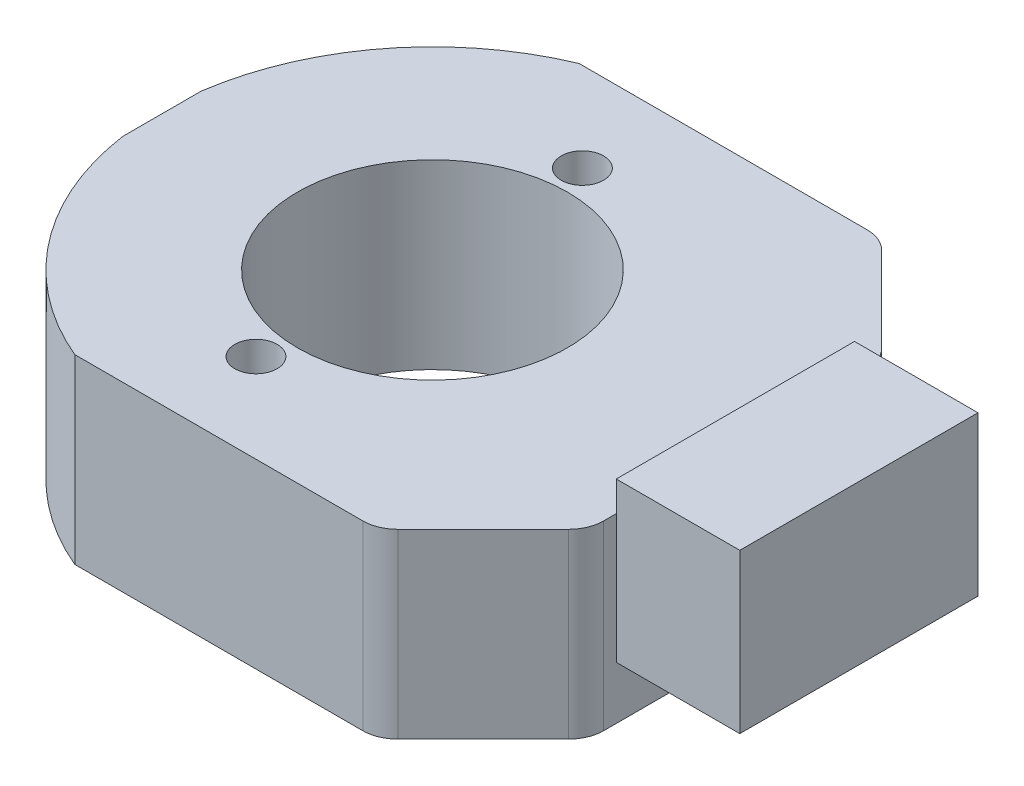
ISO-10303-21;
HEADER;
FILE_DESCRIPTION(('STEP AP214'),'2;1');
FILE_NAME('part.step','',(''),(''),'','','');
FILE_SCHEMA(('AUTOMOTIVE_DESIGN { 1 0 10303 214 1 1 1 1 }'));
ENDSEC;
DATA;
#1=APPLICATION_CONTEXT('core data for automotive mechanical design processes');
#2=APPLICATION_PROTOCOL_DEFINITION('international standard','automotive_design',2000,#1);
#3=PRODUCT_CONTEXT('',#1,'mechanical');
#4=PRODUCT('Part','Part','',(#3));
#5=PRODUCT_RELATED_PRODUCT_CATEGORY('part','',(#4));
#6=PRODUCT_DEFINITION_FORMATION('','',#4);
#7=PRODUCT_DEFINITION_CONTEXT('part definition',#1,'design');
#8=PRODUCT_DEFINITION('design','',#6,#7);
#9=PRODUCT_DEFINITION_SHAPE('','',#8);
#10=(LENGTH_UNIT() NAMED_UNIT(*) SI_UNIT(.MILLI.,.METRE.));
#11=(NAMED_UNIT(*) PLANE_ANGLE_UNIT() SI_UNIT($,.RADIAN.));
#12=(NAMED_UNIT(*) SI_UNIT($,.STERADIAN.) SOLID_ANGLE_UNIT());
#13=UNCERTAINTY_MEASURE_WITH_UNIT(LENGTH_MEASURE(1.E-05),#10,'distance_accuracy_value','');
#14=(GEOMETRIC_REPRESENTATION_CONTEXT(3) GLOBAL_UNCERTAINTY_ASSIGNED_CONTEXT((#13)) GLOBAL_UNIT_ASSIGNED_CONTEXT((#10,
#11,#12)) REPRESENTATION_CONTEXT('',''));
#15=CARTESIAN_POINT('',(0.,0.,0.));
#16=DIRECTION('',(0.,0.,1.));
#17=DIRECTION('',(1.,0.,0.));
#18=AXIS2_PLACEMENT_3D('',#15,#16,#17);
#19=CARTESIAN_POINT('',(17.17,10.3,0.));
#20=DIRECTION('',(1.,0.,0.));
#21=DIRECTION('',(0.,0.,-1.));
#22=AXIS2_PLACEMENT_3D('',#19,#20,#21);
#23=PLANE('',#22);
#24=DIRECTION('',(0.,0.,1.));
#25=VECTOR('',#24,1.);
#26=CARTESIAN_POINT('',(17.17,3.,-6.75));
#27=LINE('',#26,#25);
#28=CARTESIAN_POINT('',(17.17,3.,-6.75));
#29=VERTEX_POINT('',#28);
#30=CARTESIAN_POINT('',(17.17,3.,6.75));
#31=VERTEX_POINT('',#30);
#32=EDGE_CURVE('E56',#29,#31,#27,.T.);
#33=ORIENTED_EDGE('',*,*,#32,.T.);
#34=DIRECTION('',(0.,-1.,0.));
#35=VECTOR('',#34,1.);
#36=CARTESIAN_POINT('',(17.17,12.,6.75));
#37=LINE('',#36,#35);
#38=CARTESIAN_POINT('',(17.17,10.3,6.75));
#39=VERTEX_POINT('',#38);
#40=EDGE_CURVE('E186',#39,#31,#37,.T.);
#41=ORIENTED_EDGE('',*,*,#40,.F.);
#42=DIRECTION('',(0.,0.,1.));
#43=VECTOR('',#42,1.);
#44=CARTESIAN_POINT('',(17.17,10.3,0.));
#45=LINE('',#44,#43);
#46=CARTESIAN_POINT('',(17.17,10.3,7.4615728752538));
#47=VERTEX_POINT('',#46);
#48=EDGE_CURVE('E215',#39,#47,#45,.T.);
#49=ORIENTED_EDGE('',*,*,#48,.T.);
#50=DIRECTION('',(0.,-1.,0.));
#51=VECTOR('',#50,1.);
#52=CARTESIAN_POINT('',(17.17,10.3,7.4615728752538));
#53=LINE('',#52,#51);
#54=CARTESIAN_POINT('',(17.17,0.,7.4615728752538));
#55=VERTEX_POINT('',#54);
#56=EDGE_CURVE('E287',#47,#55,#53,.T.);
#57=ORIENTED_EDGE('',*,*,#56,.T.);
#58=DIRECTION('',(0.,0.,1.));
#59=VECTOR('',#58,1.);
#60=CARTESIAN_POINT('',(17.17,0.,0.));
#61=LINE('',#60,#59);
#62=CARTESIAN_POINT('',(17.17,0.,-7.46157287525379));
#63=VERTEX_POINT('',#62);
#64=EDGE_CURVE('E234',#63,#55,#61,.T.);
#65=ORIENTED_EDGE('',*,*,#64,.F.);
#66=DIRECTION('',(0.,-1.,0.));
#67=VECTOR('',#66,1.);
#68=CARTESIAN_POINT('',(17.17,10.3,-7.46157287525379));
#69=LINE('',#68,#67);
#70=CARTESIAN_POINT('',(17.17,10.3,-7.46157287525379));
#71=VERTEX_POINT('',#70);
#72=EDGE_CURVE('E290',#63,#71,#69,.F.);
#73=ORIENTED_EDGE('',*,*,#72,.T.);
#74=CARTESIAN_POINT('',(17.17,10.3,-6.75));
#75=VERTEX_POINT('',#74);
#76=EDGE_CURVE('E216',#71,#75,#45,.T.);
#77=ORIENTED_EDGE('',*,*,#76,.T.);
#78=DIRECTION('',(0.,-1.,0.));
#79=VECTOR('',#78,1.);
#80=CARTESIAN_POINT('',(17.17,12.,-6.75));
#81=LINE('',#80,#79);
#82=EDGE_CURVE('E61',#75,#29,#81,.T.);
#83=ORIENTED_EDGE('',*,*,#82,.T.);
#84=EDGE_LOOP('',(#33,#41,#49,#57,#65,#73,#77,#83));
#85=FACE_BOUND('',#84,.T.);
#86=ADVANCED_FACE('F41',(#85),#23,.T.);
#87=CARTESIAN_POINT('',(-15.33,10.3,0.));
#88=DIRECTION('',(1.,0.,0.));
#89=DIRECTION('',(0.,0.,-1.));
#90=AXIS2_PLACEMENT_3D('',#87,#88,#89);
#91=PLANE('',#90);
#92=DIRECTION('',(0.,0.,1.));
#93=VECTOR('',#92,1.);
#94=CARTESIAN_POINT('',(-15.33,0.,0.));
#95=LINE('',#94,#93);
#96=CARTESIAN_POINT('',(-15.33,0.,-2.22063054108513));
#97=VERTEX_POINT('',#96);
#98=CARTESIAN_POINT('',(-15.33,0.,2.22063054108513));
#99=VERTEX_POINT('',#98);
#100=EDGE_CURVE('E226',#97,#99,#95,.T.);
#101=ORIENTED_EDGE('',*,*,#100,.T.);
#102=DIRECTION('',(0.,-1.,0.));
#103=VECTOR('',#102,1.);
#104=CARTESIAN_POINT('',(-15.33,10.3,2.22063054108513));
#105=LINE('',#104,#103);
#106=CARTESIAN_POINT('',(-15.33,10.3,2.22063054108513));
#107=VERTEX_POINT('',#106);
#108=EDGE_CURVE('E248',#107,#99,#105,.T.);
#109=ORIENTED_EDGE('',*,*,#108,.F.);
#110=DIRECTION('',(0.,0.,1.));
#111=VECTOR('',#110,1.);
#112=CARTESIAN_POINT('',(-15.33,10.3,0.));
#113=LINE('',#112,#111);
#114=CARTESIAN_POINT('',(-15.33,10.3,-2.22063054108513));
#115=VERTEX_POINT('',#114);
#116=EDGE_CURVE('E206',#115,#107,#113,.T.);
#117=ORIENTED_EDGE('',*,*,#116,.F.);
#118=DIRECTION('',(0.,-1.,0.));
#119=VECTOR('',#118,1.);
#120=CARTESIAN_POINT('',(-15.33,10.3,-2.22063054108513));
#121=LINE('',#120,#119);
#122=EDGE_CURVE('E223',#115,#97,#121,.T.);
#123=ORIENTED_EDGE('',*,*,#122,.T.);
#124=EDGE_LOOP('',(#101,#109,#117,#123));
#125=FACE_BOUND('',#124,.T.);
#126=ADVANCED_FACE('F349',(#125),#91,.F.);
#127=CARTESIAN_POINT('',(0.,10.3,0.));
#128=DIRECTION('',(0.,-1.,0.));
#129=DIRECTION('',(0.,0.,-1.));
#130=AXIS2_PLACEMENT_3D('',#127,#128,#129);
#131=CYLINDRICAL_SURFACE('',#130,15.49);
#132=CARTESIAN_POINT('',(0.,0.,0.));
#133=DIRECTION('',(0.,1.,0.));
#134=DIRECTION('',(0.,0.,1.));
#135=AXIS2_PLACEMENT_3D('',#132,#133,#134);
#136=CIRCLE('',#135,15.49);
#137=CARTESIAN_POINT('',(-5.97795951809647,0.,14.29));
#138=VERTEX_POINT('',#137);
#139=EDGE_CURVE('E229',#99,#138,#136,.T.);
#140=ORIENTED_EDGE('',*,*,#139,.T.);
#141=DIRECTION('',(0.,-1.,0.));
#142=VECTOR('',#141,1.);
#143=CARTESIAN_POINT('',(-5.97795951809647,10.3,14.29));
#144=LINE('',#143,#142);
#145=CARTESIAN_POINT('',(-5.97795951809647,10.3,14.29));
#146=VERTEX_POINT('',#145);
#147=EDGE_CURVE('E245',#146,#138,#144,.T.);
#148=ORIENTED_EDGE('',*,*,#147,.F.);
#149=CARTESIAN_POINT('',(0.,10.3,0.));
#150=DIRECTION('',(0.,1.,0.));
#151=DIRECTION('',(0.,0.,1.));
#152=AXIS2_PLACEMENT_3D('',#149,#150,#151);
#153=CIRCLE('',#152,15.49);
#154=EDGE_CURVE('E210',#107,#146,#153,.T.);
#155=ORIENTED_EDGE('',*,*,#154,.F.);
#156=ORIENTED_EDGE('',*,*,#108,.T.);
#157=EDGE_LOOP('',(#140,#148,#155,#156));
#158=FACE_BOUND('',#157,.T.);
#159=ADVANCED_FACE('F356',(#158),#131,.T.);
#160=CARTESIAN_POINT('',(0.,10.3,14.29));
#161=DIRECTION('',(0.,0.,-1.));
#162=DIRECTION('',(-1.,0.,0.));
#163=AXIS2_PLACEMENT_3D('',#160,#161,#162);
#164=PLANE('',#163);
#165=DIRECTION('',(1.,0.,0.));
#166=VECTOR('',#165,1.);
#167=CARTESIAN_POINT('',(0.,0.,14.29));
#168=LINE('',#167,#166);
#169=CARTESIAN_POINT('',(10.3415728752538,0.,14.29));
#170=VERTEX_POINT('',#169);
#171=EDGE_CURVE('E231',#138,#170,#168,.T.);
#172=ORIENTED_EDGE('',*,*,#171,.T.);
#173=DIRECTION('',(0.,1.,0.));
#174=VECTOR('',#173,1.);
#175=CARTESIAN_POINT('',(10.3415728752538,10.3,14.29));
#176=LINE('',#175,#174);
#177=CARTESIAN_POINT('',(10.3415728752538,10.3,14.29));
#178=VERTEX_POINT('',#177);
#179=EDGE_CURVE('E11',#170,#178,#176,.T.);
#180=ORIENTED_EDGE('',*,*,#179,.T.);
#181=DIRECTION('',(1.,0.,0.));
#182=VECTOR('',#181,1.);
#183=CARTESIAN_POINT('',(0.,10.3,14.29));
#184=LINE('',#183,#182);
#185=EDGE_CURVE('E212',#146,#178,#184,.T.);
#186=ORIENTED_EDGE('',*,*,#185,.F.);
#187=ORIENTED_EDGE('',*,*,#147,.T.);
#188=EDGE_LOOP('',(#172,#180,#186,#187));
#189=FACE_BOUND('',#188,.T.);
#190=ADVANCED_FACE('F363',(#189),#164,.F.);
#191=CARTESIAN_POINT('',(0.,10.3,-14.29));
#192=DIRECTION('',(0.,0.,-1.));
#193=DIRECTION('',(-1.,0.,0.));
#194=AXIS2_PLACEMENT_3D('',#191,#192,#193);
#195=PLANE('',#194);
#196=DIRECTION('',(1.,0.,0.));
#197=VECTOR('',#196,1.);
#198=CARTESIAN_POINT('',(0.,10.3,-14.29));
#199=LINE('',#198,#197);
#200=CARTESIAN_POINT('',(-5.97795951809646,10.3,-14.29));
#201=VERTEX_POINT('',#200);
#202=CARTESIAN_POINT('',(10.3415728752538,10.3,-14.29));
#203=VERTEX_POINT('',#202);
#204=EDGE_CURVE('E218',#201,#203,#199,.T.);
#205=ORIENTED_EDGE('',*,*,#204,.T.);
#206=DIRECTION('',(0.,1.,0.));
#207=VECTOR('',#206,1.);
#208=CARTESIAN_POINT('',(10.3415728752538,10.3,-14.29));
#209=LINE('',#208,#207);
#210=CARTESIAN_POINT('',(10.3415728752538,0.,-14.29));
#211=VERTEX_POINT('',#210);
#212=EDGE_CURVE('E263',#203,#211,#209,.F.);
#213=ORIENTED_EDGE('',*,*,#212,.T.);
#214=DIRECTION('',(1.,0.,0.));
#215=VECTOR('',#214,1.);
#216=CARTESIAN_POINT('',(0.,0.,-14.29));
#217=LINE('',#216,#215);
#218=CARTESIAN_POINT('',(-5.97795951809646,0.,-14.29));
#219=VERTEX_POINT('',#218);
#220=EDGE_CURVE('E237',#219,#211,#217,.T.);
#221=ORIENTED_EDGE('',*,*,#220,.F.);
#222=DIRECTION('',(0.,-1.,0.));
#223=VECTOR('',#222,1.);
#224=CARTESIAN_POINT('',(-5.97795951809646,10.3,-14.29));
#225=LINE('',#224,#223);
#226=EDGE_CURVE('E243',#201,#219,#225,.T.);
#227=ORIENTED_EDGE('',*,*,#226,.F.);
#228=EDGE_LOOP('',(#205,#213,#221,#227));
#229=FACE_BOUND('',#228,.T.);
#230=ADVANCED_FACE('F361',(#229),#195,.T.);
#231=CARTESIAN_POINT('',(0.,10.3,0.));
#232=DIRECTION('',(0.,-1.,0.));
#233=DIRECTION('',(0.,0.,-1.));
#234=AXIS2_PLACEMENT_3D('',#231,#232,#233);
#235=CYLINDRICAL_SURFACE('',#234,7.65);
#236=CARTESIAN_POINT('',(0.,10.3,0.));
#237=DIRECTION('',(0.,1.,0.));
#238=DIRECTION('',(0.,0.,1.));
#239=AXIS2_PLACEMENT_3D('',#236,#237,#238);
#240=CIRCLE('',#239,7.65);
#241=CARTESIAN_POINT('',(0.,10.3,-7.65));
#242=VERTEX_POINT('',#241);
#243=EDGE_CURVE('E203',#242,#242,#240,.T.);
#244=CARTESIAN_POINT('',(0.,0.,0.));
#245=DIRECTION('',(0.,1.,0.));
#246=DIRECTION('',(0.,0.,1.));
#247=AXIS2_PLACEMENT_3D('',#244,#245,#246);
#248=CIRCLE('',#247,7.65);
#249=CARTESIAN_POINT('',(0.,0.,-7.65));
#250=VERTEX_POINT('',#249);
#251=EDGE_CURVE('E202',#250,#250,#248,.T.);
#252=CARTESIAN_POINT('',(0.,10.3,-7.65));
#253=CARTESIAN_POINT('',(0.,10.1927083333333,-7.65));
#254=CARTESIAN_POINT('',(0.,10.0854166666667,-7.65));
#255=CARTESIAN_POINT('',(0.,9.87083333333333,-7.65));
#256=CARTESIAN_POINT('',(0.,9.76354166666667,-7.65));
#257=CARTESIAN_POINT('',(0.,9.54895833333333,-7.65));
#258=CARTESIAN_POINT('',(0.,9.44166666666667,-7.65));
#259=CARTESIAN_POINT('',(0.,9.22708333333333,-7.65));
#260=CARTESIAN_POINT('',(0.,9.11979166666667,-7.65));
#261=CARTESIAN_POINT('',(0.,8.90520833333333,-7.65));
#262=CARTESIAN_POINT('',(0.,8.79791666666667,-7.65));
#263=CARTESIAN_POINT('',(0.,8.58333333333333,-7.65));
#264=CARTESIAN_POINT('',(0.,8.47604166666667,-7.65));
#265=CARTESIAN_POINT('',(0.,8.26145833333333,-7.65));
#266=CARTESIAN_POINT('',(0.,8.15416666666667,-7.65));
#267=CARTESIAN_POINT('',(0.,7.93958333333333,-7.65));
#268=CARTESIAN_POINT('',(0.,7.83229166666667,-7.65));
#269=CARTESIAN_POINT('',(0.,7.61770833333333,-7.65));
#270=CARTESIAN_POINT('',(0.,7.51041666666667,-7.65));
#271=CARTESIAN_POINT('',(0.,7.29583333333333,-7.65));
#272=CARTESIAN_POINT('',(0.,7.18854166666667,-7.65));
#273=CARTESIAN_POINT('',(0.,6.97395833333333,-7.65));
#274=CARTESIAN_POINT('',(0.,6.86666666666667,-7.65));
#275=CARTESIAN_POINT('',(0.,6.65208333333333,-7.65));
#276=CARTESIAN_POINT('',(0.,6.54479166666667,-7.65));
#277=CARTESIAN_POINT('',(0.,6.33020833333333,-7.65));
#278=CARTESIAN_POINT('',(0.,6.22291666666667,-7.65));
#279=CARTESIAN_POINT('',(0.,6.00833333333333,-7.65));
#280=CARTESIAN_POINT('',(0.,5.90104166666667,-7.65));
#281=CARTESIAN_POINT('',(0.,5.68645833333333,-7.65));
#282=CARTESIAN_POINT('',(0.,5.57916666666667,-7.65));
#283=CARTESIAN_POINT('',(0.,5.36458333333333,-7.65));
#284=CARTESIAN_POINT('',(0.,5.25729166666667,-7.65));
#285=CARTESIAN_POINT('',(0.,5.04270833333333,-7.65));
#286=CARTESIAN_POINT('',(0.,4.93541666666667,-7.65));
#287=CARTESIAN_POINT('',(0.,4.72083333333333,-7.65));
#288=CARTESIAN_POINT('',(0.,4.61354166666667,-7.65));
#289=CARTESIAN_POINT('',(0.,4.39895833333333,-7.65));
#290=CARTESIAN_POINT('',(0.,4.29166666666667,-7.65));
#291=CARTESIAN_POINT('',(0.,4.07708333333333,-7.65));
#292=CARTESIAN_POINT('',(0.,3.96979166666667,-7.65));
#293=CARTESIAN_POINT('',(0.,3.75520833333333,-7.65));
#294=CARTESIAN_POINT('',(0.,3.64791666666667,-7.65));
#295=CARTESIAN_POINT('',(0.,3.43333333333333,-7.65));
#296=CARTESIAN_POINT('',(0.,3.32604166666667,-7.65));
#297=CARTESIAN_POINT('',(0.,3.11145833333333,-7.65));
#298=CARTESIAN_POINT('',(0.,3.00416666666667,-7.65));
#299=CARTESIAN_POINT('',(0.,2.78958333333333,-7.65));
#300=CARTESIAN_POINT('',(0.,2.68229166666667,-7.65));
#301=CARTESIAN_POINT('',(0.,2.46770833333333,-7.65));
#302=CARTESIAN_POINT('',(0.,2.36041666666667,-7.65));
#303=CARTESIAN_POINT('',(0.,2.14583333333333,-7.65));
#304=CARTESIAN_POINT('',(0.,2.03854166666667,-7.65));
#305=CARTESIAN_POINT('',(0.,1.82395833333333,-7.65));
#306=CARTESIAN_POINT('',(0.,1.71666666666667,-7.65));
#307=CARTESIAN_POINT('',(0.,1.50208333333333,-7.65));
#308=CARTESIAN_POINT('',(0.,1.39479166666667,-7.65));
#309=CARTESIAN_POINT('',(0.,1.18020833333333,-7.65));
#310=CARTESIAN_POINT('',(0.,1.07291666666666,-7.65));
#311=CARTESIAN_POINT('',(0.,0.858333333333331,-7.65));
#312=CARTESIAN_POINT('',(0.,0.751041666666665,-7.65));
#313=CARTESIAN_POINT('',(0.,0.536458333333331,-7.65));
#314=CARTESIAN_POINT('',(0.,0.429166666666664,-7.65));
#315=CARTESIAN_POINT('',(0.,0.214583333333331,-7.65));
#316=CARTESIAN_POINT('',(0.,0.107291666666665,-7.65));
#317=CARTESIAN_POINT('',(0.,0.,-7.65));
#318=B_SPLINE_CURVE_WITH_KNOTS('',3,(#252,#253,#254,#255,#256,#257,#258,#259,#260,#261,#262,
#263,#264,#265,#266,#267,#268,#269,#270,#271,#272,#273,#274,#275,#276,#277,#278,#279,#280,#281,
#282,#283,#284,#285,#286,#287,#288,#289,#290,#291,#292,#293,#294,#295,#296,#297,#298,#299,#300,
#301,#302,#303,#304,#305,#306,#307,#308,#309,#310,#311,#312,#313,#314,#315,#316,#317),
.UNSPECIFIED.,.F.,.F.,(4,2,2,2,2,2,2,2,2,2,2,2,2,2,2,2,2,2,2,2,2,2,2,2,2,2,2,2,2,2,2,2,4),(0.,
0.321874999999999,0.643749999999998,0.965625,1.2875,1.609375,1.93125,2.253125,2.575,2.896875,
3.21875,3.540625,3.8625,4.184375,4.50625,4.828125,5.15,5.471875,5.79375,6.115625,6.4375,
6.759375,7.08125,7.403125,7.725,8.046875,8.36875,8.690625,9.0125,9.334375,9.65625,9.978125,
10.3),.UNSPECIFIED.);
#319=EDGE_CURVE('BSEAM370',#242,#250,#318,.T.);
#320=ORIENTED_EDGE('',*,*,#243,.T.);
#321=ORIENTED_EDGE('',*,*,#251,.F.);
#322=ORIENTED_EDGE('',*,*,#319,.T.);
#323=ORIENTED_EDGE('',*,*,#319,.F.);
#324=EDGE_LOOP('',(#320,#322,#321,#323));
#325=FACE_BOUND('',#324,.T.);
#326=ADVANCED_FACE('F370',(#325),#235,.F.);
#327=CARTESIAN_POINT('',(0.,10.3,0.));
#328=DIRECTION('',(0.,-1.,0.));
#329=DIRECTION('',(0.,0.,-1.));
#330=AXIS2_PLACEMENT_3D('',#327,#328,#329);
#331=CYLINDRICAL_SURFACE('',#330,15.49);
#332=CARTESIAN_POINT('',(0.,0.,0.));
#333=DIRECTION('',(0.,1.,0.));
#334=DIRECTION('',(0.,0.,1.));
#335=AXIS2_PLACEMENT_3D('',#332,#333,#334);
#336=CIRCLE('',#335,15.49);
#337=EDGE_CURVE('E207',#219,#97,#336,.T.);
#338=ORIENTED_EDGE('',*,*,#337,.T.);
#339=ORIENTED_EDGE('',*,*,#122,.F.);
#340=CARTESIAN_POINT('',(0.,10.3,0.));
#341=DIRECTION('',(0.,1.,0.));
#342=DIRECTION('',(0.,0.,1.));
#343=AXIS2_PLACEMENT_3D('',#340,#341,#342);
#344=CIRCLE('',#343,15.49);
#345=EDGE_CURVE('E221',#201,#115,#344,.T.);
#346=ORIENTED_EDGE('',*,*,#345,.F.);
#347=ORIENTED_EDGE('',*,*,#226,.T.);
#348=EDGE_LOOP('',(#338,#339,#346,#347));
#349=FACE_BOUND('',#348,.T.);
#350=ADVANCED_FACE('F373',(#349),#331,.T.);
#351=CARTESIAN_POINT('',(0.,10.3,0.));
#352=DIRECTION('',(0.,1.,0.));
#353=DIRECTION('',(0.,0.,1.));
#354=AXIS2_PLACEMENT_3D('',#351,#352,#353);
#355=PLANE('',#354);
#356=CARTESIAN_POINT('',(-0.75,10.3,9.25));
#357=DIRECTION('',(0.,1.,0.));
#358=DIRECTION('',(0.,0.,1.));
#359=AXIS2_PLACEMENT_3D('',#356,#357,#358);
#360=CIRCLE('',#359,1.2);
#361=CARTESIAN_POINT('',(-0.75,10.3,8.05));
#362=VERTEX_POINT('',#361);
#363=EDGE_CURVE('E199',#362,#362,#360,.T.);
#364=ORIENTED_EDGE('',*,*,#363,.F.);
#365=EDGE_LOOP('',(#364));
#366=FACE_BOUND('',#365,.T.);
#367=CARTESIAN_POINT('',(-0.75,10.3,-9.25));
#368=DIRECTION('',(0.,1.,0.));
#369=DIRECTION('',(0.,0.,1.));
#370=AXIS2_PLACEMENT_3D('',#367,#368,#369);
#371=CIRCLE('',#370,1.2);
#372=CARTESIAN_POINT('',(-0.75,10.3,-10.45));
#373=VERTEX_POINT('',#372);
#374=EDGE_CURVE('E195',#373,#373,#371,.T.);
#375=ORIENTED_EDGE('',*,*,#374,.F.);
#376=EDGE_LOOP('',(#375));
#377=FACE_BOUND('',#376,.T.);
#378=ORIENTED_EDGE('',*,*,#243,.F.);
#379=EDGE_LOOP('',(#378));
#380=FACE_BOUND('',#379,.T.);
#381=DIRECTION('',(0.707106781186547,0.,0.707106781186548));
#382=VECTOR('',#381,1.);
#383=CARTESIAN_POINT('',(12.73,10.3,-12.73));
#384=LINE('',#383,#382);
#385=CARTESIAN_POINT('',(16.5842135623731,10.3,-8.87578643762689));
#386=VERTEX_POINT('',#385);
#387=CARTESIAN_POINT('',(11.7557864376269,10.3,-13.7042135623731));
#388=VERTEX_POINT('',#387);
#389=EDGE_CURVE('E260',#386,#388,#384,.F.);
#390=ORIENTED_EDGE('',*,*,#389,.T.);
#391=CARTESIAN_POINT('',(10.3415728752538,10.3,-12.29));
#392=DIRECTION('',(0.,1.,0.));
#393=DIRECTION('',(0.,0.,1.));
#394=AXIS2_PLACEMENT_3D('',#391,#392,#393);
#395=CIRCLE('',#394,2.);
#396=EDGE_CURVE('E285',#388,#203,#395,.T.);
#397=ORIENTED_EDGE('',*,*,#396,.T.);
#398=ORIENTED_EDGE('',*,*,#204,.F.);
#399=ORIENTED_EDGE('',*,*,#345,.T.);
#400=ORIENTED_EDGE('',*,*,#116,.T.);
#401=ORIENTED_EDGE('',*,*,#154,.T.);
#402=ORIENTED_EDGE('',*,*,#185,.T.);
#403=CARTESIAN_POINT('',(10.3415728752538,10.3,12.29));
#404=DIRECTION('',(0.,1.,0.));
#405=DIRECTION('',(0.,0.,1.));
#406=AXIS2_PLACEMENT_3D('',#403,#404,#405);
#407=CIRCLE('',#406,2.);
#408=CARTESIAN_POINT('',(11.7557864376269,10.3,13.7042135623731));
#409=VERTEX_POINT('',#408);
#410=EDGE_CURVE('E278',#178,#409,#407,.T.);
#411=ORIENTED_EDGE('',*,*,#410,.T.);
#412=DIRECTION('',(0.707106781186548,0.,-0.707106781186547));
#413=VECTOR('',#412,1.);
#414=CARTESIAN_POINT('',(12.73,10.3,12.73));
#415=LINE('',#414,#413);
#416=CARTESIAN_POINT('',(16.5842135623731,10.3,8.8757864376269));
#417=VERTEX_POINT('',#416);
#418=EDGE_CURVE('E257',#409,#417,#415,.T.);
#419=ORIENTED_EDGE('',*,*,#418,.T.);
#420=CARTESIAN_POINT('',(15.17,10.3,7.4615728752538));
#421=DIRECTION('',(0.,1.,0.));
#422=DIRECTION('',(0.,0.,1.));
#423=AXIS2_PLACEMENT_3D('',#420,#421,#422);
#424=CIRCLE('',#423,2.);
#425=EDGE_CURVE('E280',#417,#47,#424,.T.);
#426=ORIENTED_EDGE('',*,*,#425,.T.);
#427=ORIENTED_EDGE('',*,*,#48,.F.);
#428=EDGE_CURVE('E184',#75,#39,#45,.T.);
#429=ORIENTED_EDGE('',*,*,#428,.F.);
#430=ORIENTED_EDGE('',*,*,#76,.F.);
#431=CARTESIAN_POINT('',(15.17,10.3,-7.46157287525379));
#432=DIRECTION('',(0.,1.,0.));
#433=DIRECTION('',(0.,0.,1.));
#434=AXIS2_PLACEMENT_3D('',#431,#432,#433);
#435=CIRCLE('',#434,2.);
#436=EDGE_CURVE('E283',#71,#386,#435,.T.);
#437=ORIENTED_EDGE('',*,*,#436,.T.);
#438=EDGE_LOOP('',(#390,#397,#398,#399,#400,#401,#402,#411,#419,#426,#427,#429,#430,#437));
#439=FACE_BOUND('',#438,.T.);
#440=ADVANCED_FACE('F303',(#366,#377,#380,#439),#355,.T.);
#441=CARTESIAN_POINT('',(0.,0.,0.));
#442=DIRECTION('',(0.,1.,0.));
#443=DIRECTION('',(0.,0.,1.));
#444=AXIS2_PLACEMENT_3D('',#441,#442,#443);
#445=PLANE('',#444);
#446=CARTESIAN_POINT('',(-0.75,0.,9.25));
#447=DIRECTION('',(0.,-1.,0.));
#448=DIRECTION('',(0.,0.,-1.));
#449=AXIS2_PLACEMENT_3D('',#446,#447,#448);
#450=CIRCLE('',#449,1.2);
#451=CARTESIAN_POINT('',(-0.75,0.,8.05));
#452=VERTEX_POINT('',#451);
#453=EDGE_CURVE('E189',#452,#452,#450,.T.);
#454=ORIENTED_EDGE('',*,*,#453,.F.);
#455=EDGE_LOOP('',(#454));
#456=FACE_BOUND('',#455,.T.);
#457=CARTESIAN_POINT('',(-0.75,0.,-9.25));
#458=DIRECTION('',(0.,-1.,0.));
#459=DIRECTION('',(0.,0.,1.));
#460=AXIS2_PLACEMENT_3D('',#457,#458,#459);
#461=CIRCLE('',#460,1.2);
#462=CARTESIAN_POINT('',(-0.75,0.,-10.45));
#463=VERTEX_POINT('',#462);
#464=EDGE_CURVE('E185',#463,#463,#461,.T.);
#465=ORIENTED_EDGE('',*,*,#464,.F.);
#466=EDGE_LOOP('',(#465));
#467=FACE_BOUND('',#466,.T.);
#468=ORIENTED_EDGE('',*,*,#251,.T.);
#469=EDGE_LOOP('',(#468));
#470=FACE_BOUND('',#469,.T.);
#471=ORIENTED_EDGE('',*,*,#220,.T.);
#472=CARTESIAN_POINT('',(10.3415728752538,0.,-12.29));
#473=DIRECTION('',(0.,1.,0.));
#474=DIRECTION('',(0.,0.,1.));
#475=AXIS2_PLACEMENT_3D('',#472,#473,#474);
#476=CIRCLE('',#475,2.);
#477=CARTESIAN_POINT('',(11.7557864376269,0.,-13.7042135623731));
#478=VERTEX_POINT('',#477);
#479=EDGE_CURVE('E272',#211,#478,#476,.F.);
#480=ORIENTED_EDGE('',*,*,#479,.T.);
#481=DIRECTION('',(-0.707106781186547,0.,-0.707106781186548));
#482=VECTOR('',#481,1.);
#483=CARTESIAN_POINT('',(11.17,0.,-14.29));
#484=LINE('',#483,#482);
#485=CARTESIAN_POINT('',(16.5842135623731,0.,-8.87578643762689));
#486=VERTEX_POINT('',#485);
#487=EDGE_CURVE('E254',#478,#486,#484,.F.);
#488=ORIENTED_EDGE('',*,*,#487,.T.);
#489=CARTESIAN_POINT('',(15.17,0.,-7.46157287525379));
#490=DIRECTION('',(0.,1.,0.));
#491=DIRECTION('',(0.,0.,1.));
#492=AXIS2_PLACEMENT_3D('',#489,#490,#491);
#493=CIRCLE('',#492,2.);
#494=EDGE_CURVE('E270',#486,#63,#493,.F.);
#495=ORIENTED_EDGE('',*,*,#494,.T.);
#496=ORIENTED_EDGE('',*,*,#64,.T.);
#497=CARTESIAN_POINT('',(15.17,0.,7.4615728752538));
#498=DIRECTION('',(0.,1.,0.));
#499=DIRECTION('',(0.,0.,1.));
#500=AXIS2_PLACEMENT_3D('',#497,#498,#499);
#501=CIRCLE('',#500,2.);
#502=CARTESIAN_POINT('',(16.5842135623731,0.,8.8757864376269));
#503=VERTEX_POINT('',#502);
#504=EDGE_CURVE('E268',#55,#503,#501,.F.);
#505=ORIENTED_EDGE('',*,*,#504,.T.);
#506=DIRECTION('',(-0.707106781186548,0.,0.707106781186547));
#507=VECTOR('',#506,1.);
#508=CARTESIAN_POINT('',(17.17,0.,8.28999999999999));
#509=LINE('',#508,#507);
#510=CARTESIAN_POINT('',(11.7557864376269,0.,13.7042135623731));
#511=VERTEX_POINT('',#510);
#512=EDGE_CURVE('E251',#503,#511,#509,.T.);
#513=ORIENTED_EDGE('',*,*,#512,.T.);
#514=CARTESIAN_POINT('',(10.3415728752538,0.,12.29));
#515=DIRECTION('',(0.,1.,0.));
#516=DIRECTION('',(0.,0.,1.));
#517=AXIS2_PLACEMENT_3D('',#514,#515,#516);
#518=CIRCLE('',#517,2.);
#519=EDGE_CURVE('E266',#511,#170,#518,.F.);
#520=ORIENTED_EDGE('',*,*,#519,.T.);
#521=ORIENTED_EDGE('',*,*,#171,.F.);
#522=ORIENTED_EDGE('',*,*,#139,.F.);
#523=ORIENTED_EDGE('',*,*,#100,.F.);
#524=ORIENTED_EDGE('',*,*,#337,.F.);
#525=EDGE_LOOP('',(#471,#480,#488,#495,#496,#505,#513,#520,#521,#522,#523,#524));
#526=FACE_BOUND('',#525,.T.);
#527=ADVANCED_FACE('F309',(#456,#467,#470,#526),#445,.F.);
#528=CARTESIAN_POINT('',(-0.75,10.5,-9.25));
#529=DIRECTION('',(0.,-1.,0.));
#530=DIRECTION('',(0.,0.,-1.));
#531=AXIS2_PLACEMENT_3D('',#528,#529,#530);
#532=CYLINDRICAL_SURFACE('',#531,1.2);
#533=CARTESIAN_POINT('',(-0.75,10.3,-10.45));
#534=CARTESIAN_POINT('',(-0.75,10.1927083333333,-10.45));
#535=CARTESIAN_POINT('',(-0.75,10.0854166666667,-10.45));
#536=CARTESIAN_POINT('',(-0.75,9.87083333333333,-10.45));
#537=CARTESIAN_POINT('',(-0.75,9.76354166666667,-10.45));
#538=CARTESIAN_POINT('',(-0.75,9.54895833333333,-10.45));
#539=CARTESIAN_POINT('',(-0.75,9.44166666666667,-10.45));
#540=CARTESIAN_POINT('',(-0.75,9.22708333333333,-10.45));
#541=CARTESIAN_POINT('',(-0.75,9.11979166666667,-10.45));
#542=CARTESIAN_POINT('',(-0.75,8.90520833333333,-10.45));
#543=CARTESIAN_POINT('',(-0.75,8.79791666666667,-10.45));
#544=CARTESIAN_POINT('',(-0.75,8.58333333333333,-10.45));
#545=CARTESIAN_POINT('',(-0.75,8.47604166666667,-10.45));
#546=CARTESIAN_POINT('',(-0.75,8.26145833333333,-10.45));
#547=CARTESIAN_POINT('',(-0.75,8.15416666666667,-10.45));
#548=CARTESIAN_POINT('',(-0.75,7.93958333333333,-10.45));
#549=CARTESIAN_POINT('',(-0.75,7.83229166666667,-10.45));
#550=CARTESIAN_POINT('',(-0.75,7.61770833333333,-10.45));
#551=CARTESIAN_POINT('',(-0.75,7.51041666666667,-10.45));
#552=CARTESIAN_POINT('',(-0.75,7.29583333333333,-10.45));
#553=CARTESIAN_POINT('',(-0.75,7.18854166666667,-10.45));
#554=CARTESIAN_POINT('',(-0.75,6.97395833333333,-10.45));
#555=CARTESIAN_POINT('',(-0.75,6.86666666666667,-10.45));
#556=CARTESIAN_POINT('',(-0.75,6.65208333333333,-10.45));
#557=CARTESIAN_POINT('',(-0.75,6.54479166666667,-10.45));
#558=CARTESIAN_POINT('',(-0.75,6.33020833333333,-10.45));
#559=CARTESIAN_POINT('',(-0.75,6.22291666666667,-10.45));
#560=CARTESIAN_POINT('',(-0.75,6.00833333333333,-10.45));
#561=CARTESIAN_POINT('',(-0.75,5.90104166666667,-10.45));
#562=CARTESIAN_POINT('',(-0.75,5.68645833333333,-10.45));
#563=CARTESIAN_POINT('',(-0.75,5.57916666666667,-10.45));
#564=CARTESIAN_POINT('',(-0.75,5.36458333333333,-10.45));
#565=CARTESIAN_POINT('',(-0.75,5.25729166666667,-10.45));
#566=CARTESIAN_POINT('',(-0.75,5.04270833333333,-10.45));
#567=CARTESIAN_POINT('',(-0.75,4.93541666666667,-10.45));
#568=CARTESIAN_POINT('',(-0.75,4.72083333333333,-10.45));
#569=CARTESIAN_POINT('',(-0.75,4.61354166666667,-10.45));
#570=CARTESIAN_POINT('',(-0.75,4.39895833333333,-10.45));
#571=CARTESIAN_POINT('',(-0.75,4.29166666666667,-10.45));
#572=CARTESIAN_POINT('',(-0.75,4.07708333333333,-10.45));
#573=CARTESIAN_POINT('',(-0.75,3.96979166666667,-10.45));
#574=CARTESIAN_POINT('',(-0.75,3.75520833333333,-10.45));
#575=CARTESIAN_POINT('',(-0.75,3.64791666666667,-10.45));
#576=CARTESIAN_POINT('',(-0.75,3.43333333333333,-10.45));
#577=CARTESIAN_POINT('',(-0.75,3.32604166666667,-10.45));
#578=CARTESIAN_POINT('',(-0.75,3.11145833333333,-10.45));
#579=CARTESIAN_POINT('',(-0.75,3.00416666666667,-10.45));
#580=CARTESIAN_POINT('',(-0.75,2.78958333333333,-10.45));
#581=CARTESIAN_POINT('',(-0.75,2.68229166666667,-10.45));
#582=CARTESIAN_POINT('',(-0.75,2.46770833333333,-10.45));
#583=CARTESIAN_POINT('',(-0.75,2.36041666666667,-10.45));
#584=CARTESIAN_POINT('',(-0.75,2.14583333333333,-10.45));
#585=CARTESIAN_POINT('',(-0.75,2.03854166666667,-10.45));
#586=CARTESIAN_POINT('',(-0.75,1.82395833333333,-10.45));
#587=CARTESIAN_POINT('',(-0.75,1.71666666666667,-10.45));
#588=CARTESIAN_POINT('',(-0.75,1.50208333333333,-10.45));
#589=CARTESIAN_POINT('',(-0.75,1.39479166666667,-10.45));
#590=CARTESIAN_POINT('',(-0.75,1.18020833333333,-10.45));
#591=CARTESIAN_POINT('',(-0.75,1.07291666666667,-10.45));
#592=CARTESIAN_POINT('',(-0.75,0.858333333333333,-10.45));
#593=CARTESIAN_POINT('',(-0.75,0.751041666666667,-10.45));
#594=CARTESIAN_POINT('',(-0.75,0.536458333333333,-10.45));
#595=CARTESIAN_POINT('',(-0.75,0.429166666666666,-10.45));
#596=CARTESIAN_POINT('',(-0.75,0.214583333333333,-10.45));
#597=CARTESIAN_POINT('',(-0.75,0.107291666666666,-10.45));
#598=CARTESIAN_POINT('',(-0.75,0.,-10.45));
#599=B_SPLINE_CURVE_WITH_KNOTS('',3,(#533,#534,#535,#536,#537,#538,#539,#540,#541,#542,#543,
#544,#545,#546,#547,#548,#549,#550,#551,#552,#553,#554,#555,#556,#557,#558,#559,#560,#561,#562,
#563,#564,#565,#566,#567,#568,#569,#570,#571,#572,#573,#574,#575,#576,#577,#578,#579,#580,#581,
#582,#583,#584,#585,#586,#587,#588,#589,#590,#591,#592,#593,#594,#595,#596,#597,#598),
.UNSPECIFIED.,.F.,.F.,(4,2,2,2,2,2,2,2,2,2,2,2,2,2,2,2,2,2,2,2,2,2,2,2,2,2,2,2,2,2,2,2,4),(0.,
0.321874999999999,0.643749999999998,0.965625,1.2875,1.609375,1.93125,2.253125,2.575,2.896875,
3.21875,3.540625,3.8625,4.184375,4.50625,4.828125,5.15,5.471875,5.79375,6.115625,6.4375,
6.759375,7.08125,7.403125,7.725,8.046875,8.36875,8.690625,9.0125,9.334375,9.65625,9.978125,
10.3),.UNSPECIFIED.);
#600=EDGE_CURVE('BSEAM431',#373,#463,#599,.T.);
#601=ORIENTED_EDGE('',*,*,#374,.T.);
#602=ORIENTED_EDGE('',*,*,#464,.T.);
#603=ORIENTED_EDGE('',*,*,#600,.T.);
#604=ORIENTED_EDGE('',*,*,#600,.F.);
#605=EDGE_LOOP('',(#601,#603,#602,#604));
#606=FACE_BOUND('',#605,.T.);
#607=ADVANCED_FACE('F431',(#606),#532,.F.);
#608=CARTESIAN_POINT('',(-0.75,10.5,9.25));
#609=DIRECTION('',(0.,-1.,0.));
#610=DIRECTION('',(0.,0.,-1.));
#611=AXIS2_PLACEMENT_3D('',#608,#609,#610);
#612=CYLINDRICAL_SURFACE('',#611,1.2);
#613=CARTESIAN_POINT('',(-0.75,10.3,8.05));
#614=CARTESIAN_POINT('',(-0.75,10.1927083333333,8.05));
#615=CARTESIAN_POINT('',(-0.75,10.0854166666667,8.05));
#616=CARTESIAN_POINT('',(-0.75,9.87083333333333,8.05));
#617=CARTESIAN_POINT('',(-0.75,9.76354166666667,8.05));
#618=CARTESIAN_POINT('',(-0.75,9.54895833333333,8.05));
#619=CARTESIAN_POINT('',(-0.75,9.44166666666667,8.05));
#620=CARTESIAN_POINT('',(-0.75,9.22708333333333,8.05));
#621=CARTESIAN_POINT('',(-0.75,9.11979166666667,8.05));
#622=CARTESIAN_POINT('',(-0.75,8.90520833333333,8.05));
#623=CARTESIAN_POINT('',(-0.75,8.79791666666667,8.05));
#624=CARTESIAN_POINT('',(-0.75,8.58333333333333,8.05));
#625=CARTESIAN_POINT('',(-0.75,8.47604166666667,8.05));
#626=CARTESIAN_POINT('',(-0.75,8.26145833333333,8.05));
#627=CARTESIAN_POINT('',(-0.75,8.15416666666667,8.05));
#628=CARTESIAN_POINT('',(-0.75,7.93958333333333,8.05));
#629=CARTESIAN_POINT('',(-0.75,7.83229166666667,8.05));
#630=CARTESIAN_POINT('',(-0.75,7.61770833333333,8.05));
#631=CARTESIAN_POINT('',(-0.75,7.51041666666667,8.05));
#632=CARTESIAN_POINT('',(-0.75,7.29583333333333,8.05));
#633=CARTESIAN_POINT('',(-0.75,7.18854166666667,8.05));
#634=CARTESIAN_POINT('',(-0.75,6.97395833333333,8.05));
#635=CARTESIAN_POINT('',(-0.75,6.86666666666667,8.05));
#636=CARTESIAN_POINT('',(-0.75,6.65208333333333,8.05));
#637=CARTESIAN_POINT('',(-0.75,6.54479166666667,8.05));
#638=CARTESIAN_POINT('',(-0.75,6.33020833333333,8.05));
#639=CARTESIAN_POINT('',(-0.75,6.22291666666667,8.05));
#640=CARTESIAN_POINT('',(-0.75,6.00833333333333,8.05));
#641=CARTESIAN_POINT('',(-0.75,5.90104166666667,8.05));
#642=CARTESIAN_POINT('',(-0.75,5.68645833333333,8.05));
#643=CARTESIAN_POINT('',(-0.75,5.57916666666667,8.05));
#644=CARTESIAN_POINT('',(-0.75,5.36458333333333,8.05));
#645=CARTESIAN_POINT('',(-0.75,5.25729166666667,8.05));
#646=CARTESIAN_POINT('',(-0.75,5.04270833333333,8.05));
#647=CARTESIAN_POINT('',(-0.75,4.93541666666667,8.05));
#648=CARTESIAN_POINT('',(-0.75,4.72083333333333,8.05));
#649=CARTESIAN_POINT('',(-0.75,4.61354166666667,8.05));
#650=CARTESIAN_POINT('',(-0.75,4.39895833333333,8.05));
#651=CARTESIAN_POINT('',(-0.75,4.29166666666667,8.05));
#652=CARTESIAN_POINT('',(-0.75,4.07708333333333,8.05));
#653=CARTESIAN_POINT('',(-0.75,3.96979166666667,8.05));
#654=CARTESIAN_POINT('',(-0.75,3.75520833333333,8.05));
#655=CARTESIAN_POINT('',(-0.75,3.64791666666667,8.05));
#656=CARTESIAN_POINT('',(-0.75,3.43333333333333,8.05));
#657=CARTESIAN_POINT('',(-0.75,3.32604166666667,8.05));
#658=CARTESIAN_POINT('',(-0.75,3.11145833333333,8.05));
#659=CARTESIAN_POINT('',(-0.75,3.00416666666667,8.05));
#660=CARTESIAN_POINT('',(-0.75,2.78958333333333,8.05));
#661=CARTESIAN_POINT('',(-0.75,2.68229166666667,8.05));
#662=CARTESIAN_POINT('',(-0.75,2.46770833333333,8.05));
#663=CARTESIAN_POINT('',(-0.75,2.36041666666667,8.05));
#664=CARTESIAN_POINT('',(-0.75,2.14583333333333,8.05));
#665=CARTESIAN_POINT('',(-0.75,2.03854166666667,8.05));
#666=CARTESIAN_POINT('',(-0.75,1.82395833333333,8.05));
#667=CARTESIAN_POINT('',(-0.75,1.71666666666667,8.05));
#668=CARTESIAN_POINT('',(-0.75,1.50208333333333,8.05));
#669=CARTESIAN_POINT('',(-0.75,1.39479166666667,8.05));
#670=CARTESIAN_POINT('',(-0.75,1.18020833333333,8.05));
#671=CARTESIAN_POINT('',(-0.75,1.07291666666667,8.05));
#672=CARTESIAN_POINT('',(-0.75,0.858333333333333,8.05));
#673=CARTESIAN_POINT('',(-0.75,0.751041666666667,8.05));
#674=CARTESIAN_POINT('',(-0.75,0.536458333333333,8.05));
#675=CARTESIAN_POINT('',(-0.75,0.429166666666666,8.05));
#676=CARTESIAN_POINT('',(-0.75,0.214583333333333,8.05));
#677=CARTESIAN_POINT('',(-0.75,0.107291666666666,8.05));
#678=CARTESIAN_POINT('',(-0.75,0.,8.05));
#679=B_SPLINE_CURVE_WITH_KNOTS('',3,(#613,#614,#615,#616,#617,#618,#619,#620,#621,#622,#623,
#624,#625,#626,#627,#628,#629,#630,#631,#632,#633,#634,#635,#636,#637,#638,#639,#640,#641,#642,
#643,#644,#645,#646,#647,#648,#649,#650,#651,#652,#653,#654,#655,#656,#657,#658,#659,#660,#661,
#662,#663,#664,#665,#666,#667,#668,#669,#670,#671,#672,#673,#674,#675,#676,#677,#678),
.UNSPECIFIED.,.F.,.F.,(4,2,2,2,2,2,2,2,2,2,2,2,2,2,2,2,2,2,2,2,2,2,2,2,2,2,2,2,2,2,2,2,4),(0.,
0.321874999999999,0.643749999999998,0.965625,1.2875,1.609375,1.93125,2.253125,2.575,2.896875,
3.21875,3.540625,3.8625,4.184375,4.50625,4.828125,5.15,5.471875,5.79375,6.115625,6.4375,
6.759375,7.08125,7.403125,7.725,8.046875,8.36875,8.690625,9.0125,9.334375,9.65625,9.978125,
10.3),.UNSPECIFIED.);
#680=EDGE_CURVE('BSEAM382',#362,#452,#679,.T.);
#681=ORIENTED_EDGE('',*,*,#363,.T.);
#682=ORIENTED_EDGE('',*,*,#453,.T.);
#683=ORIENTED_EDGE('',*,*,#680,.T.);
#684=ORIENTED_EDGE('',*,*,#680,.F.);
#685=EDGE_LOOP('',(#681,#683,#682,#684));
#686=FACE_BOUND('',#685,.T.);
#687=ADVANCED_FACE('F382',(#686),#612,.F.);
#688=CARTESIAN_POINT('',(11.17,10.3,-14.29));
#689=DIRECTION('',(-0.707106781186548,0.,0.707106781186547));
#690=DIRECTION('',(0.,-1.,0.));
#691=AXIS2_PLACEMENT_3D('',#688,#689,#690);
#692=PLANE('',#691);
#693=ORIENTED_EDGE('',*,*,#487,.F.);
#694=DIRECTION('',(0.,-1.,0.));
#695=VECTOR('',#694,1.);
#696=CARTESIAN_POINT('',(11.7557864376269,10.3,-13.7042135623731));
#697=LINE('',#696,#695);
#698=EDGE_CURVE('E276',#478,#388,#697,.F.);
#699=ORIENTED_EDGE('',*,*,#698,.T.);
#700=ORIENTED_EDGE('',*,*,#389,.F.);
#701=DIRECTION('',(0.,1.,0.));
#702=VECTOR('',#701,1.);
#703=CARTESIAN_POINT('',(16.5842135623731,10.3,-8.87578643762689));
#704=LINE('',#703,#702);
#705=EDGE_CURVE('E274',#386,#486,#704,.F.);
#706=ORIENTED_EDGE('',*,*,#705,.T.);
#707=EDGE_LOOP('',(#693,#699,#700,#706));
#708=FACE_BOUND('',#707,.T.);
#709=ADVANCED_FACE('F376',(#708),#692,.F.);
#710=CARTESIAN_POINT('',(17.17,10.3,8.28999999999999));
#711=DIRECTION('',(0.707106781186547,0.,0.707106781186548));
#712=DIRECTION('',(0.,1.,0.));
#713=AXIS2_PLACEMENT_3D('',#710,#711,#712);
#714=PLANE('',#713);
#715=ORIENTED_EDGE('',*,*,#512,.F.);
#716=DIRECTION('',(0.,-1.,0.));
#717=VECTOR('',#716,1.);
#718=CARTESIAN_POINT('',(16.5842135623731,10.3,8.8757864376269));
#719=LINE('',#718,#717);
#720=EDGE_CURVE('E49',#503,#417,#719,.F.);
#721=ORIENTED_EDGE('',*,*,#720,.T.);
#722=ORIENTED_EDGE('',*,*,#418,.F.);
#723=DIRECTION('',(0.,1.,0.));
#724=VECTOR('',#723,1.);
#725=CARTESIAN_POINT('',(11.7557864376269,0.,13.7042135623731));
#726=LINE('',#725,#724);
#727=EDGE_CURVE('E293',#409,#511,#726,.F.);
#728=ORIENTED_EDGE('',*,*,#727,.T.);
#729=EDGE_LOOP('',(#715,#721,#722,#728));
#730=FACE_BOUND('',#729,.T.);
#731=ADVANCED_FACE('F298',(#730),#714,.T.);
#732=CARTESIAN_POINT('',(10.3415728752538,10.3,-12.29));
#733=DIRECTION('',(0.,1.,0.));
#734=DIRECTION('',(0.,0.,1.));
#735=AXIS2_PLACEMENT_3D('',#732,#733,#734);
#736=CYLINDRICAL_SURFACE('',#735,2.);
#737=ORIENTED_EDGE('',*,*,#396,.F.);
#738=ORIENTED_EDGE('',*,*,#698,.F.);
#739=ORIENTED_EDGE('',*,*,#479,.F.);
#740=ORIENTED_EDGE('',*,*,#212,.F.);
#741=EDGE_LOOP('',(#737,#738,#739,#740));
#742=FACE_BOUND('',#741,.T.);
#743=ADVANCED_FACE('F388',(#742),#736,.T.);
#744=CARTESIAN_POINT('',(15.17,10.3,-7.46157287525379));
#745=DIRECTION('',(0.,-1.,0.));
#746=DIRECTION('',(0.,0.,-1.));
#747=AXIS2_PLACEMENT_3D('',#744,#745,#746);
#748=CYLINDRICAL_SURFACE('',#747,2.);
#749=ORIENTED_EDGE('',*,*,#494,.F.);
#750=ORIENTED_EDGE('',*,*,#705,.F.);
#751=ORIENTED_EDGE('',*,*,#436,.F.);
#752=ORIENTED_EDGE('',*,*,#72,.F.);
#753=EDGE_LOOP('',(#749,#750,#751,#752));
#754=FACE_BOUND('',#753,.T.);
#755=ADVANCED_FACE('F314',(#754),#748,.T.);
#756=CARTESIAN_POINT('',(15.17,10.3,7.4615728752538));
#757=DIRECTION('',(0.,-1.,0.));
#758=DIRECTION('',(0.,0.,-1.));
#759=AXIS2_PLACEMENT_3D('',#756,#757,#758);
#760=CYLINDRICAL_SURFACE('',#759,2.);
#761=ORIENTED_EDGE('',*,*,#425,.F.);
#762=ORIENTED_EDGE('',*,*,#720,.F.);
#763=ORIENTED_EDGE('',*,*,#504,.F.);
#764=ORIENTED_EDGE('',*,*,#56,.F.);
#765=EDGE_LOOP('',(#761,#762,#763,#764));
#766=FACE_BOUND('',#765,.T.);
#767=ADVANCED_FACE('F305',(#766),#760,.T.);
#768=CARTESIAN_POINT('',(10.3415728752538,10.3,12.29));
#769=DIRECTION('',(0.,-1.,0.));
#770=DIRECTION('',(0.,0.,-1.));
#771=AXIS2_PLACEMENT_3D('',#768,#769,#770);
#772=CYLINDRICAL_SURFACE('',#771,2.);
#773=ORIENTED_EDGE('',*,*,#519,.F.);
#774=ORIENTED_EDGE('',*,*,#727,.F.);
#775=ORIENTED_EDGE('',*,*,#410,.F.);
#776=ORIENTED_EDGE('',*,*,#179,.F.);
#777=EDGE_LOOP('',(#773,#774,#775,#776));
#778=FACE_BOUND('',#777,.T.);
#779=ADVANCED_FACE('F43',(#778),#772,.T.);
#780=CARTESIAN_POINT('',(17.17,12.,-6.75));
#781=DIRECTION('',(1.,0.,0.));
#782=DIRECTION('',(0.,0.,-1.));
#783=AXIS2_PLACEMENT_3D('',#780,#781,#782);
#784=PLANE('',#783);
#785=ORIENTED_EDGE('',*,*,#428,.T.);
#786=CARTESIAN_POINT('',(17.17,12.,6.75));
#787=VERTEX_POINT('',#786);
#788=EDGE_CURVE('E165',#787,#39,#37,.T.);
#789=ORIENTED_EDGE('',*,*,#788,.F.);
#790=DIRECTION('',(0.,0.,1.));
#791=VECTOR('',#790,1.);
#792=CARTESIAN_POINT('',(17.17,12.,-6.75));
#793=LINE('',#792,#791);
#794=CARTESIAN_POINT('',(17.17,12.,-6.75));
#795=VERTEX_POINT('',#794);
#796=EDGE_CURVE('E171',#795,#787,#793,.T.);
#797=ORIENTED_EDGE('',*,*,#796,.F.);
#798=EDGE_CURVE('E330',#795,#75,#81,.T.);
#799=ORIENTED_EDGE('',*,*,#798,.T.);
#800=EDGE_LOOP('',(#785,#789,#797,#799));
#801=FACE_BOUND('',#800,.T.);
#802=ADVANCED_FACE('F183',(#801),#784,.F.);
#803=CARTESIAN_POINT('',(17.17,12.,6.75));
#804=DIRECTION('',(0.,0.,-1.));
#805=DIRECTION('',(-1.,0.,0.));
#806=AXIS2_PLACEMENT_3D('',#803,#804,#805);
#807=PLANE('',#806);
#808=DIRECTION('',(1.,0.,0.));
#809=VECTOR('',#808,1.);
#810=CARTESIAN_POINT('',(17.17,3.,6.75));
#811=LINE('',#810,#809);
#812=CARTESIAN_POINT('',(24.17,3.,6.75));
#813=VERTEX_POINT('',#812);
#814=EDGE_CURVE('E318',#31,#813,#811,.T.);
#815=ORIENTED_EDGE('',*,*,#814,.T.);
#816=DIRECTION('',(0.,-1.,0.));
#817=VECTOR('',#816,1.);
#818=CARTESIAN_POINT('',(24.17,12.,6.75));
#819=LINE('',#818,#817);
#820=CARTESIAN_POINT('',(24.17,12.,6.75));
#821=VERTEX_POINT('',#820);
#822=EDGE_CURVE('E167',#821,#813,#819,.T.);
#823=ORIENTED_EDGE('',*,*,#822,.F.);
#824=DIRECTION('',(1.,0.,0.));
#825=VECTOR('',#824,1.);
#826=CARTESIAN_POINT('',(17.17,12.,6.75));
#827=LINE('',#826,#825);
#828=EDGE_CURVE('E161',#787,#821,#827,.T.);
#829=ORIENTED_EDGE('',*,*,#828,.F.);
#830=ORIENTED_EDGE('',*,*,#788,.T.);
#831=ORIENTED_EDGE('',*,*,#40,.T.);
#832=EDGE_LOOP('',(#815,#823,#829,#830,#831));
#833=FACE_BOUND('',#832,.T.);
#834=ADVANCED_FACE('F163',(#833),#807,.F.);
#835=CARTESIAN_POINT('',(24.17,12.,-6.75));
#836=DIRECTION('',(-1.,0.,0.));
#837=DIRECTION('',(0.,0.,1.));
#838=AXIS2_PLACEMENT_3D('',#835,#836,#837);
#839=PLANE('',#838);
#840=DIRECTION('',(0.,0.,-1.));
#841=VECTOR('',#840,1.);
#842=CARTESIAN_POINT('',(24.17,3.,-6.75));
#843=LINE('',#842,#841);
#844=CARTESIAN_POINT('',(24.17,3.,-6.75));
#845=VERTEX_POINT('',#844);
#846=EDGE_CURVE('E323',#813,#845,#843,.T.);
#847=ORIENTED_EDGE('',*,*,#846,.T.);
#848=DIRECTION('',(0.,-1.,0.));
#849=VECTOR('',#848,1.);
#850=CARTESIAN_POINT('',(24.17,12.,-6.75));
#851=LINE('',#850,#849);
#852=CARTESIAN_POINT('',(24.17,12.,-6.75));
#853=VERTEX_POINT('',#852);
#854=EDGE_CURVE('E331',#853,#845,#851,.T.);
#855=ORIENTED_EDGE('',*,*,#854,.F.);
#856=DIRECTION('',(0.,0.,-1.));
#857=VECTOR('',#856,1.);
#858=CARTESIAN_POINT('',(24.17,12.,-6.75));
#859=LINE('',#858,#857);
#860=EDGE_CURVE('E170',#821,#853,#859,.T.);
#861=ORIENTED_EDGE('',*,*,#860,.F.);
#862=ORIENTED_EDGE('',*,*,#822,.T.);
#863=EDGE_LOOP('',(#847,#855,#861,#862));
#864=FACE_BOUND('',#863,.T.);
#865=ADVANCED_FACE('F336',(#864),#839,.F.);
#866=CARTESIAN_POINT('',(17.17,12.,-6.75));
#867=DIRECTION('',(0.,0.,1.));
#868=DIRECTION('',(1.,0.,0.));
#869=AXIS2_PLACEMENT_3D('',#866,#867,#868);
#870=PLANE('',#869);
#871=DIRECTION('',(-1.,0.,0.));
#872=VECTOR('',#871,1.);
#873=CARTESIAN_POINT('',(17.17,3.,-6.75));
#874=LINE('',#873,#872);
#875=EDGE_CURVE('E180',#845,#29,#874,.T.);
#876=ORIENTED_EDGE('',*,*,#875,.T.);
#877=ORIENTED_EDGE('',*,*,#82,.F.);
#878=ORIENTED_EDGE('',*,*,#798,.F.);
#879=DIRECTION('',(-1.,0.,0.));
#880=VECTOR('',#879,1.);
#881=CARTESIAN_POINT('',(17.17,12.,-6.75));
#882=LINE('',#881,#880);
#883=EDGE_CURVE('E176',#853,#795,#882,.T.);
#884=ORIENTED_EDGE('',*,*,#883,.F.);
#885=ORIENTED_EDGE('',*,*,#854,.T.);
#886=EDGE_LOOP('',(#876,#877,#878,#884,#885));
#887=FACE_BOUND('',#886,.T.);
#888=ADVANCED_FACE('F338',(#887),#870,.F.);
#889=CARTESIAN_POINT('',(0.,12.,0.));
#890=DIRECTION('',(0.,1.,0.));
#891=DIRECTION('',(0.,0.,1.));
#892=AXIS2_PLACEMENT_3D('',#889,#890,#891);
#893=PLANE('',#892);
#894=ORIENTED_EDGE('',*,*,#796,.T.);
#895=ORIENTED_EDGE('',*,*,#828,.T.);
#896=ORIENTED_EDGE('',*,*,#860,.T.);
#897=ORIENTED_EDGE('',*,*,#883,.T.);
#898=EDGE_LOOP('',(#894,#895,#896,#897));
#899=FACE_BOUND('',#898,.T.);
#900=ADVANCED_FACE('F174',(#899),#893,.T.);
#901=CARTESIAN_POINT('',(0.,3.,0.));
#902=DIRECTION('',(0.,1.,0.));
#903=DIRECTION('',(0.,0.,1.));
#904=AXIS2_PLACEMENT_3D('',#901,#902,#903);
#905=PLANE('',#904);
#906=ORIENTED_EDGE('',*,*,#32,.F.);
#907=ORIENTED_EDGE('',*,*,#875,.F.);
#908=ORIENTED_EDGE('',*,*,#846,.F.);
#909=ORIENTED_EDGE('',*,*,#814,.F.);
#910=EDGE_LOOP('',(#906,#907,#908,#909));
#911=FACE_BOUND('',#910,.T.);
#912=ADVANCED_FACE('F321',(#911),#905,.F.);
#913=CLOSED_SHELL('',(#86,#126,#159,#190,#230,#326,#350,#440,#527,#607,#687,#709,#731,#743,#755,
#767,#779,#802,#834,#865,#888,#900,#912));
#914=MANIFOLD_SOLID_BREP('B2',#913);
#915=ADVANCED_BREP_SHAPE_REPRESENTATION('',(#18,#914),#14);
#916=SHAPE_DEFINITION_REPRESENTATION(#9,#915);
ENDSEC;
END-ISO-10303-21;
